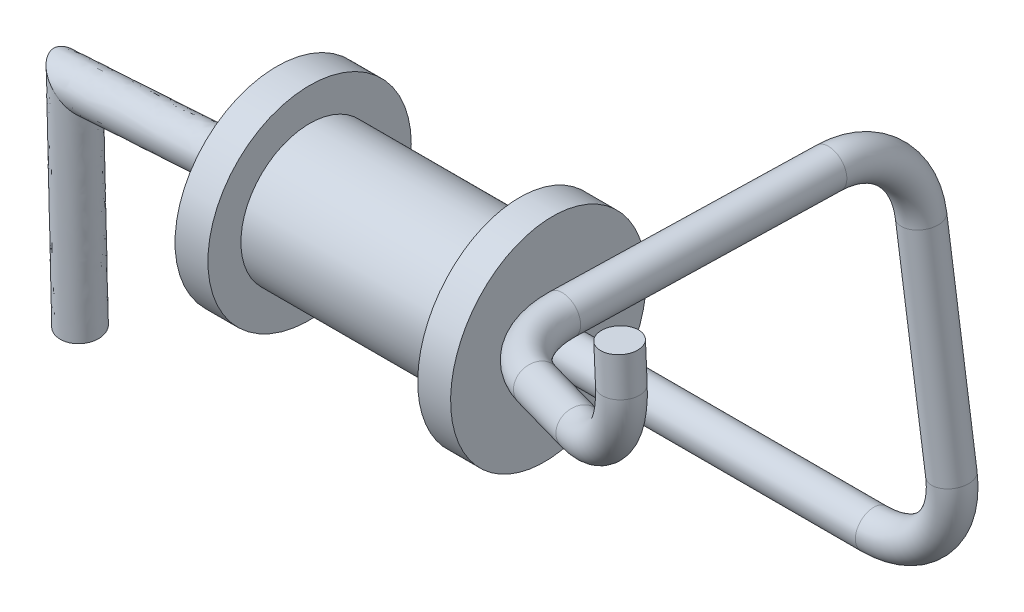
ISO-10303-21;
HEADER;
FILE_DESCRIPTION(('STEP AP214'),'2;1');
FILE_NAME('part.step','',(''),(''),'','','');
FILE_SCHEMA(('AUTOMOTIVE_DESIGN { 1 0 10303 214 1 1 1 1 }'));
ENDSEC;
DATA;
#1=APPLICATION_CONTEXT('core data for automotive mechanical design processes');
#2=APPLICATION_PROTOCOL_DEFINITION('international standard','automotive_design',2000,#1);
#3=PRODUCT_CONTEXT('',#1,'mechanical');
#4=PRODUCT('Part','Part','',(#3));
#5=PRODUCT_RELATED_PRODUCT_CATEGORY('part','',(#4));
#6=PRODUCT_DEFINITION_FORMATION('','',#4);
#7=PRODUCT_DEFINITION_CONTEXT('part definition',#1,'design');
#8=PRODUCT_DEFINITION('design','',#6,#7);
#9=PRODUCT_DEFINITION_SHAPE('','',#8);
#10=(LENGTH_UNIT() NAMED_UNIT(*) SI_UNIT(.MILLI.,.METRE.));
#11=(NAMED_UNIT(*) PLANE_ANGLE_UNIT() SI_UNIT($,.RADIAN.));
#12=(NAMED_UNIT(*) SI_UNIT($,.STERADIAN.) SOLID_ANGLE_UNIT());
#13=UNCERTAINTY_MEASURE_WITH_UNIT(LENGTH_MEASURE(1.E-05),#10,'distance_accuracy_value','');
#14=(GEOMETRIC_REPRESENTATION_CONTEXT(3) GLOBAL_UNCERTAINTY_ASSIGNED_CONTEXT((#13)) GLOBAL_UNIT_ASSIGNED_CONTEXT((#10,
#11,#12)) REPRESENTATION_CONTEXT('',''));
#15=CARTESIAN_POINT('',(0.,0.,0.));
#16=DIRECTION('',(0.,0.,1.));
#17=DIRECTION('',(1.,0.,0.));
#18=AXIS2_PLACEMENT_3D('',#15,#16,#17);
#19=CARTESIAN_POINT('',(4.,0.,0.));
#20=DIRECTION('',(-1.,0.,0.));
#21=DIRECTION('',(0.,0.,1.));
#22=AXIS2_PLACEMENT_3D('',#19,#20,#21);
#23=CYLINDRICAL_SURFACE('',#22,12.3707155239652);
#24=CARTESIAN_POINT('',(4.,0.,0.));
#25=DIRECTION('',(1.,0.,0.));
#26=DIRECTION('',(0.,0.,-1.));
#27=AXIS2_PLACEMENT_3D('',#24,#25,#26);
#28=CIRCLE('',#27,12.3707155239652);
#29=CARTESIAN_POINT('',(4.,0.,-12.3707155239652));
#30=VERTEX_POINT('',#29);
#31=EDGE_CURVE('E148',#30,#30,#28,.T.);
#32=ORIENTED_EDGE('',*,*,#31,.F.);
#33=EDGE_LOOP('',(#32));
#34=FACE_BOUND('',#33,.T.);
#35=CARTESIAN_POINT('',(0.,0.,0.));
#36=DIRECTION('',(1.,0.,0.));
#37=DIRECTION('',(0.,0.,-1.));
#38=AXIS2_PLACEMENT_3D('',#35,#36,#37);
#39=CIRCLE('',#38,12.3707155239652);
#40=CARTESIAN_POINT('',(0.,0.,-12.3707155239652));
#41=VERTEX_POINT('',#40);
#42=EDGE_CURVE('E36',#41,#41,#39,.T.);
#43=ORIENTED_EDGE('',*,*,#42,.T.);
#44=EDGE_LOOP('',(#43));
#45=FACE_BOUND('',#44,.T.);
#46=ADVANCED_FACE('F33',(#34,#45),#23,.T.);
#47=CARTESIAN_POINT('',(4.,0.,0.));
#48=DIRECTION('',(1.,0.,0.));
#49=DIRECTION('',(0.,0.,-1.));
#50=AXIS2_PLACEMENT_3D('',#47,#48,#49);
#51=PLANE('',#50);
#52=CARTESIAN_POINT('',(4.,0.,0.));
#53=DIRECTION('',(1.,0.,0.));
#54=DIRECTION('',(0.,0.,-1.));
#55=AXIS2_PLACEMENT_3D('',#52,#53,#54);
#56=CIRCLE('',#55,8.35595579056687);
#57=CARTESIAN_POINT('',(4.,0.,-8.35595579056687));
#58=VERTEX_POINT('',#57);
#59=EDGE_CURVE('E45',#58,#58,#56,.T.);
#60=ORIENTED_EDGE('',*,*,#59,.F.);
#61=EDGE_LOOP('',(#60));
#62=FACE_BOUND('',#61,.T.);
#63=ORIENTED_EDGE('',*,*,#31,.T.);
#64=EDGE_LOOP('',(#63));
#65=FACE_BOUND('',#64,.T.);
#66=ADVANCED_FACE('F137',(#62,#65),#51,.T.);
#67=CARTESIAN_POINT('',(0.,0.,0.));
#68=DIRECTION('',(1.,0.,0.));
#69=DIRECTION('',(0.,0.,-1.));
#70=AXIS2_PLACEMENT_3D('',#67,#68,#69);
#71=PLANE('',#70);
#72=CARTESIAN_POINT('',(0.,0.,0.));
#73=DIRECTION('',(-1.,0.,0.));
#74=DIRECTION('',(0.,0.,1.));
#75=AXIS2_PLACEMENT_3D('',#72,#73,#74);
#76=CIRCLE('',#75,2.44207125569347);
#77=CARTESIAN_POINT('',(0.,0.,2.44207125569347));
#78=VERTEX_POINT('',#77);
#79=EDGE_CURVE('E40',#78,#78,#76,.T.);
#80=ORIENTED_EDGE('',*,*,#79,.F.);
#81=EDGE_LOOP('',(#80));
#82=FACE_BOUND('',#81,.T.);
#83=ORIENTED_EDGE('',*,*,#42,.F.);
#84=EDGE_LOOP('',(#83));
#85=FACE_BOUND('',#84,.T.);
#86=ADVANCED_FACE('F142',(#82,#85),#71,.F.);
#87=CARTESIAN_POINT('',(29.,0.,0.));
#88=DIRECTION('',(-1.,0.,0.));
#89=DIRECTION('',(0.,0.,1.));
#90=AXIS2_PLACEMENT_3D('',#87,#88,#89);
#91=CYLINDRICAL_SURFACE('',#90,8.35595579056687);
#92=CARTESIAN_POINT('',(29.,0.,0.));
#93=DIRECTION('',(1.,0.,0.));
#94=DIRECTION('',(0.,0.,-1.));
#95=AXIS2_PLACEMENT_3D('',#92,#93,#94);
#96=CIRCLE('',#95,8.35595579056687);
#97=CARTESIAN_POINT('',(29.,0.,-8.35595579056687));
#98=VERTEX_POINT('',#97);
#99=EDGE_CURVE('E152',#98,#98,#96,.T.);
#100=ORIENTED_EDGE('',*,*,#99,.F.);
#101=EDGE_LOOP('',(#100));
#102=FACE_BOUND('',#101,.T.);
#103=ORIENTED_EDGE('',*,*,#59,.T.);
#104=EDGE_LOOP('',(#103));
#105=FACE_BOUND('',#104,.T.);
#106=ADVANCED_FACE('F164',(#102,#105),#91,.T.);
#107=CARTESIAN_POINT('',(33.,0.100289249061352,-0.065763954930336));
#108=DIRECTION('',(1.,0.,0.));
#109=DIRECTION('',(0.,-0.959592970850484,0.281391773679228));
#110=AXIS2_PLACEMENT_3D('',#107,#108,#109);
#111=ELLIPSE('',#110,12.7666889089816,11.8329045708875);
#112=DIRECTION('',(-1.,0.,0.));
#113=VECTOR('',#112,1.);
#114=SURFACE_OF_LINEAR_EXTRUSION('',#111,#113);
#115=CARTESIAN_POINT('',(33.,-12.1505356890322,3.52667728117892));
#116=VERTEX_POINT('',#115);
#117=EDGE_CURVE('E154',#116,#116,#111,.T.);
#118=ORIENTED_EDGE('',*,*,#117,.F.);
#119=EDGE_LOOP('',(#118));
#120=FACE_BOUND('',#119,.T.);
#121=CARTESIAN_POINT('',(29.,0.100289249061352,-0.065763954930336));
#122=DIRECTION('',(1.,0.,0.));
#123=DIRECTION('',(0.,-0.959592970850484,0.281391773679228));
#124=AXIS2_PLACEMENT_3D('',#121,#122,#123);
#125=ELLIPSE('',#124,12.7666889089816,11.8329045708875);
#126=CARTESIAN_POINT('',(29.,-12.1505356890322,3.52667728117892));
#127=VERTEX_POINT('',#126);
#128=EDGE_CURVE('E84',#127,#127,#125,.T.);
#129=ORIENTED_EDGE('',*,*,#128,.T.);
#130=EDGE_LOOP('',(#129));
#131=FACE_BOUND('',#130,.T.);
#132=ADVANCED_FACE('F167',(#120,#131),#114,.F.);
#133=CARTESIAN_POINT('',(33.,0.100289249061352,-0.065763954930336));
#134=DIRECTION('',(1.,0.,0.));
#135=DIRECTION('',(0.,0.,-1.));
#136=AXIS2_PLACEMENT_3D('',#133,#134,#135);
#137=PLANE('',#136);
#138=CARTESIAN_POINT('',(33.,0.,0.));
#139=DIRECTION('',(1.,0.,0.));
#140=DIRECTION('',(0.,0.,-1.));
#141=AXIS2_PLACEMENT_3D('',#138,#139,#140);
#142=CIRCLE('',#141,2.22597131513763);
#143=CARTESIAN_POINT('',(33.,0.,-2.22597131513763));
#144=VERTEX_POINT('',#143);
#145=EDGE_CURVE('E10',#144,#144,#142,.T.);
#146=ORIENTED_EDGE('',*,*,#145,.F.);
#147=EDGE_LOOP('',(#146));
#148=FACE_BOUND('',#147,.T.);
#149=ORIENTED_EDGE('',*,*,#117,.T.);
#150=EDGE_LOOP('',(#149));
#151=FACE_BOUND('',#150,.T.);
#152=ADVANCED_FACE('F174',(#148,#151),#137,.T.);
#153=CARTESIAN_POINT('',(29.,0.100289249061352,-0.065763954930336));
#154=DIRECTION('',(1.,0.,0.));
#155=DIRECTION('',(0.,0.,-1.));
#156=AXIS2_PLACEMENT_3D('',#153,#154,#155);
#157=PLANE('',#156);
#158=ORIENTED_EDGE('',*,*,#99,.T.);
#159=EDGE_LOOP('',(#158));
#160=FACE_BOUND('',#159,.T.);
#161=ORIENTED_EDGE('',*,*,#128,.F.);
#162=EDGE_LOOP('',(#161));
#163=FACE_BOUND('',#162,.T.);
#164=ADVANCED_FACE('F179',(#160,#163),#157,.F.);
#165=CARTESIAN_POINT('',(-23.3305297371578,-26.3298090305077,0.595999902795145));
#166=DIRECTION('',(-0.0155432074786544,-0.9965610600113,-0.0813908002813002));
#167=DIRECTION('',(0.0281251309692267,-0.0818041813511398,0.996251500837732));
#168=AXIS2_PLACEMENT_3D('',#165,#166,#167);
#169=PLANE('',#168);
#170=CARTESIAN_POINT('',(-23.3305297371578,-26.3298090305077,0.595999902795145));
#171=DIRECTION('',(-0.0155432074786544,-0.9965610600113,-0.0813908002813002));
#172=DIRECTION('',(0.0281251309692267,-0.0818041813511398,0.996251500837732));
#173=AXIS2_PLACEMENT_3D('',#170,#171,#172);
#174=CIRCLE('',#173,2.44207125569347);
#175=CARTESIAN_POINT('',(-23.2618461632552,-26.5295806703809,3.02891705643245));
#176=VERTEX_POINT('',#175);
#177=EDGE_CURVE('E74',#176,#176,#174,.T.);
#178=ORIENTED_EDGE('',*,*,#177,.T.);
#179=EDGE_LOOP('',(#178));
#180=FACE_BOUND('',#179,.T.);
#181=ADVANCED_FACE('F103',(#180),#169,.T.);
#182=CARTESIAN_POINT('',(-23.2028706245278,5.07524915346956,3.86902853192067));
#183=CARTESIAN_POINT('',(-23.2618461632552,-26.5295806703809,3.02891705643245));
#184=CARTESIAN_POINT('',(-28.0844907669103,5.13969940357206,4.01213346644188));
#185=CARTESIAN_POINT('',(-28.1434663056377,-26.4651304202784,3.17202199095365));
#186=CARTESIAN_POINT('',(-28.2218579147155,5.53924268331837,-0.853700840832734));
#187=CARTESIAN_POINT('',(-28.2808334534428,-26.0655871405321,-1.69381231632096));
#188=CARTESIAN_POINT('',(-23.340237772333,5.47479243321586,-0.996805775353938));
#189=CARTESIAN_POINT('',(-23.3992133110603,-26.1300373906346,-1.83691725084216));
#190=CARTESIAN_POINT('',(-18.4586176299505,5.41034218311336,-1.13991070987514));
#191=CARTESIAN_POINT('',(-18.5175931686778,-26.1944876407371,-1.98002218536337));
#192=CARTESIAN_POINT('',(-18.3212504821453,5.01079890336705,3.72592359739947));
#193=CARTESIAN_POINT('',(-18.3802260208727,-26.5940309204834,2.88581212191125));
#194=CARTESIAN_POINT('',(-23.2028706245278,5.07524915346956,3.86902853192067));
#195=CARTESIAN_POINT('',(-23.2618461632552,-26.5295806703809,3.02891705643245));
#196=(BOUNDED_SURFACE() B_SPLINE_SURFACE(3,1,((#182,#183),(#184,#185),(#186,#187),(#188,#189),
(#190,#191),(#192,#193),(#194,#195)),.UNSPECIFIED.,.T.,.F.,.F.) B_SPLINE_SURFACE_WITH_KNOTS((4,
3,4),(2,2),(0.,0.5,1.),(0.,1.),
.UNSPECIFIED.) GEOMETRIC_REPRESENTATION_ITEM() RATIONAL_B_SPLINE_SURFACE(((1.,1.),
(0.333333333333333,0.333333333333333),(0.333333333333333,0.333333333333333),(1.,1.),
(0.333333333333333,0.333333333333333),(0.333333333333333,0.333333333333333),(1.,1.))) REPRESENTATION_ITEM('') SURFACE());
#197=CARTESIAN_POINT('',(-23.2128663806339,-0.281449191471586,3.72663815122899));
#198=CARTESIAN_POINT('',(-23.0684587121008,-0.424443925889251,3.71864875398941));
#199=CARTESIAN_POINT('',(-22.924534512076,-0.567324026092381,3.69784049343618));
#200=CARTESIAN_POINT('',(-22.63883423045,-0.851697510933992,3.63022198284289));
#201=CARTESIAN_POINT('',(-22.4970893935195,-0.99316662981185,3.58317803038561));
#202=CARTESIAN_POINT('',(-22.21963915056,-1.27090377430165,3.46193241064531));
#203=CARTESIAN_POINT('',(-22.0839413806909,-1.40716519443489,3.38769743927248));
#204=CARTESIAN_POINT('',(-21.8403446025068,-1.65267887183553,3.22250429081013));
#205=CARTESIAN_POINT('',(-21.7311692724878,-1.7630902202218,3.13517082803063));
#206=CARTESIAN_POINT('',(-21.523940202056,-1.97356334684906,2.93772139186325));
#207=CARTESIAN_POINT('',(-21.4258694183012,-2.07364096399891,2.82764108480416));
#208=CARTESIAN_POINT('',(-21.2685792169189,-2.23518677640959,2.61450531712893));
#209=CARTESIAN_POINT('',(-21.2057945458416,-2.30003212148381,2.51665821976654));
#210=CARTESIAN_POINT('',(-21.0922219384939,-2.41823345476983,2.30786859765149));
#211=CARTESIAN_POINT('',(-21.0414178206382,-2.47160493149555,2.19694404349324));
#212=CARTESIAN_POINT('',(-20.9634606357256,-2.55466788572738,1.98558890031515));
#213=CARTESIAN_POINT('',(-20.9336491489583,-2.58693087295371,1.88715975817442));
#214=CARTESIAN_POINT('',(-20.8861212931429,-2.6396674671327,1.68435934220253));
#215=CARTESIAN_POINT('',(-20.8683968707516,-2.66014892243247,1.57999207514129));
#216=CARTESIAN_POINT('',(-20.8465277658761,-2.68779422185828,1.36744854524152));
#217=CARTESIAN_POINT('',(-20.842459836027,-2.69488269733116,1.25925419620652));
#218=CARTESIAN_POINT('',(-20.8487837569033,-2.69475175716478,1.04329822373755));
#219=CARTESIAN_POINT('',(-20.8591722891677,-2.68753562496725,0.935536506687566));
#220=CARTESIAN_POINT('',(-20.8922203732133,-2.66058027775096,0.733820644079748));
#221=CARTESIAN_POINT('',(-20.9136791619833,-2.64203853707522,0.639501596230035));
#222=CARTESIAN_POINT('',(-20.9668415698841,-2.59466546999811,0.456545708227726));
#223=CARTESIAN_POINT('',(-20.9985469759998,-2.56583234871349,0.367909862445247));
#224=CARTESIAN_POINT('',(-21.0729482339714,-2.49724989396901,0.192421072495969));
#225=CARTESIAN_POINT('',(-21.1162144902333,-2.45692327333233,0.106039410006878));
#226=CARTESIAN_POINT('',(-21.2106714959056,-2.36818002321727,-0.0577106099738942));
#227=CARTESIAN_POINT('',(-21.2618668505383,-2.31975869102284,-0.135073683408106));
#228=CARTESIAN_POINT('',(-21.4009897462154,-2.18749635886743,-0.321393696363401));
#229=CARTESIAN_POINT('',(-21.4934123605298,-2.09902361501496,-0.423728530244451));
#230=CARTESIAN_POINT('',(-21.6884362884356,-1.91139969954375,-0.606690991734129));
#231=CARTESIAN_POINT('',(-21.7910635649717,-1.81222123237972,-0.687261206475955));
#232=CARTESIAN_POINT('',(-22.0423748297233,-1.5684973601089,-0.854290379223574));
#233=CARTESIAN_POINT('',(-22.1939764413289,-1.42081283200187,-0.931766255117624));
#234=CARTESIAN_POINT('',(-22.5033775853207,-1.11832874512138,-1.05187992626143));
#235=CARTESIAN_POINT('',(-22.6611804878002,-0.963525309574913,-1.09449849603694));
#236=CARTESIAN_POINT('',(-22.9828106234001,-0.647062634163571,-1.1479883325709));
#237=CARTESIAN_POINT('',(-23.1466915422022,-0.485328023176628,-1.15807303334321));
#238=CARTESIAN_POINT('',(-23.4735705496054,-0.161803096026666,-1.14548442691826));
#239=CARTESIAN_POINT('',(-23.6365674466851,-1.29196625368519E-05,-1.12277449209639));
#240=CARTESIAN_POINT('',(-23.8914095150296,0.253695801463184,-1.0606903249533));
#241=CARTESIAN_POINT('',(-23.9847888641693,0.346825455604939,-1.03209950756872));
#242=CARTESIAN_POINT('',(-24.1692803132398,0.531170755031897,-0.963363600502911));
#243=CARTESIAN_POINT('',(-24.2603916548123,0.622385758554771,-0.923214701039456));
#244=CARTESIAN_POINT('',(-24.4392193251888,0.801794459002192,-0.831092283443859));
#245=CARTESIAN_POINT('',(-24.5269415403331,0.889993360653054,-0.779140455116842));
#246=CARTESIAN_POINT('',(-24.6979633072726,1.06236756583207,-0.662929102592391));
#247=CARTESIAN_POINT('',(-24.7812662687555,1.14654596623877,-0.59867924868648));
#248=CARTESIAN_POINT('',(-24.9551752388245,1.32281529807729,-0.445751904262429));
#249=CARTESIAN_POINT('',(-25.0447657286359,1.4139666766093,-0.354801065267833));
#250=CARTESIAN_POINT('',(-25.2128955166439,1.58585956532774,-0.15469965227404));
#251=CARTESIAN_POINT('',(-25.2914525005864,1.6666177171426,-0.0455788313650212));
#252=CARTESIAN_POINT('',(-25.4182907978081,1.79801233728255,0.165969549504738));
#253=CARTESIAN_POINT('',(-25.4694614697152,1.8514071639757,0.264932649734763));
#254=CARTESIAN_POINT('',(-25.5596038594051,1.94643945429959,0.473552319138405));
#255=CARTESIAN_POINT('',(-25.5985899210037,1.98809073682076,0.583196113856821));
#256=CARTESIAN_POINT('',(-25.6562890005796,2.05106347232968,0.792360580841113));
#257=CARTESIAN_POINT('',(-25.6772813983696,2.07460158686155,0.890581479777734));
#258=CARTESIAN_POINT('',(-25.7071937073611,2.10985468447219,1.09098530146758));
#259=CARTESIAN_POINT('',(-25.7161211931254,2.12157708448704,1.19316569688532));
#260=CARTESIAN_POINT('',(-25.719807654174,2.12958869769749,1.34723387541147));
#261=CARTESIAN_POINT('',(-25.7194077589957,2.13065591125226,1.39883341418816));
#262=CARTESIAN_POINT('',(-25.7153375438002,2.1295526181451,1.50187645042235));
#263=CARTESIAN_POINT('',(-25.7116675879481,2.12738247198846,1.5533199646152));
#264=CARTESIAN_POINT('',(-25.7010896904947,2.1198245767064,1.6556292286261));
#265=CARTESIAN_POINT('',(-25.694181949871,2.11443702728781,1.70649501410456));
#266=CARTESIAN_POINT('',(-25.6772334131906,2.10053747540749,1.80727523408451));
#267=CARTESIAN_POINT('',(-25.6671914932973,2.09202435200145,1.85718932050802));
#268=CARTESIAN_POINT('',(-25.6337154430965,2.06297918407042,2.00010342422111));
#269=CARTESIAN_POINT('',(-25.606363501643,2.03852660367626,2.09143816065783));
#270=CARTESIAN_POINT('',(-25.5422392436122,1.98012197155552,2.26754408719776));
#271=CARTESIAN_POINT('',(-25.50545608745,1.94615898506085,2.35230757779115));
#272=CARTESIAN_POINT('',(-25.4367239304189,1.88208273008365,2.48903970380018));
#273=CARTESIAN_POINT('',(-25.4068062387844,1.85403513903713,2.54303442704334));
#274=CARTESIAN_POINT('',(-25.34379656596,1.7946920704096,2.64715600779253));
#275=CARTESIAN_POINT('',(-25.3107075231671,1.76339959719406,2.69728636954773));
#276=CARTESIAN_POINT('',(-25.2072169143514,1.66518626367176,2.84201921648317));
#277=CARTESIAN_POINT('',(-25.1326705573184,1.59400297774131,2.93081148200242));
#278=CARTESIAN_POINT('',(-24.9469342096803,1.41581897550897,3.12286810150022));
#279=CARTESIAN_POINT('',(-24.8323433519552,1.30526702508718,3.21946538945701));
#280=CARTESIAN_POINT('',(-24.5939959707554,1.07435287329118,3.38624794139292));
#281=CARTESIAN_POINT('',(-24.4702196331513,0.95396940452282,3.45637399817355));
#282=CARTESIAN_POINT('',(-24.2526091778536,0.741653161543106,3.55599737456876));
#283=CARTESIAN_POINT('',(-24.1600172586588,0.651115013319645,3.59136986958842));
#284=CARTESIAN_POINT('',(-23.9730300319736,0.467912605354942,3.65000687184844));
#285=CARTESIAN_POINT('',(-23.878633868135,0.375247331601284,3.67326547369868));
#286=CARTESIAN_POINT('',(-23.6890480294883,0.188801376849432,3.70810833805332));
#287=CARTESIAN_POINT('',(-23.5938594586375,0.0950221885101755,3.71970675612891));
#288=CARTESIAN_POINT('',(-23.4033327483039,-0.0930044145664909,3.73160141801773));
#289=CARTESIAN_POINT('',(-23.3079946641031,-0.187251675727057,3.7319011518236));
#290=CARTESIAN_POINT('',(-23.2128663806339,-0.281449191471586,3.72663815122899));
#291=B_SPLINE_CURVE_WITH_KNOTS('',3,(#197,#198,#199,#200,#201,#202,#203,#204,#205,#206,#207,
#208,#209,#210,#211,#212,#213,#214,#215,#216,#217,#218,#219,#220,#221,#222,#223,#224,#225,#226,
#227,#228,#229,#230,#231,#232,#233,#234,#235,#236,#237,#238,#239,#240,#241,#242,#243,#244,#245,
#246,#247,#248,#249,#250,#251,#252,#253,#254,#255,#256,#257,#258,#259,#260,#261,#262,#263,#264,
#265,#266,#267,#268,#269,#270,#271,#272,#273,#274,#275,#276,#277,#278,#279,#280,#281,#282,#283,
#284,#285,#286,#287,#288,#289,#290),.UNSPECIFIED.,.T.,.F.,(4,2,2,2,2,2,2,2,2,2,2,2,2,2,2,2,2,2,
2,2,2,2,2,2,2,2,2,2,2,2,2,2,2,2,2,2,2,2,2,2,2,2,2,2,2,2,4),(0.,0.609878966037011,
1.22527944683679,1.84143621649082,2.37417488597034,2.90608449169785,3.30408374675637,
3.70154232348091,4.02359783649103,4.34543856084903,4.66908510292824,4.99265736464026,
5.28682858828857,5.58105114238771,5.8939718404048,6.20707496914526,6.69582033612733,
7.18584264573011,7.85837127241032,8.53127058118206,9.22032111448952,9.91014182902196,
10.314532308881,10.7190562371044,11.122842714919,11.5263129785585,11.9953990717825,
12.4637244636286,12.8330125100851,13.2018641759741,13.5100676330414,13.8180775045581,
13.9727414405039,14.127388154698,14.2820252708424,14.4367178997303,14.7306742727636,
15.0249700252952,15.2281154288139,15.4310743960022,15.8375438916717,16.3933397621192,
16.9503714962603,17.3525454688702,17.7549153138111,18.1567960860007,18.5585527222817),.UNSPECIFIED.);
#292=CARTESIAN_POINT('',(-23.2128663806339,-0.281449191471586,3.72663815122899));
#293=VERTEX_POINT('',#292);
#294=EDGE_CURVE('E76',#293,#293,#291,.T.);
#295=ORIENTED_EDGE('',*,*,#294,.F.);
#296=EDGE_LOOP('',(#295));
#297=FACE_BOUND('',#296,.T.);
#298=ORIENTED_EDGE('',*,*,#177,.F.);
#299=EDGE_LOOP('',(#298));
#300=FACE_BOUND('',#299,.T.);
#301=ADVANCED_FACE('F187',(#297,#300),#196,.T.);
#302=CARTESIAN_POINT('',(0.,0.,2.44207125569347));
#303=CARTESIAN_POINT('',(-28.8177382927566,-0.349406618275403,4.03680376343604));
#304=CARTESIAN_POINT('',(0.,4.88414251138694,2.44207125569347));
#305=CARTESIAN_POINT('',(-28.8177382927566,4.53473589311154,4.03680376343604));
#306=CARTESIAN_POINT('',(0.,4.88414251138694,-2.44207125569347));
#307=CARTESIAN_POINT('',(-28.8177382927566,4.53473589311154,-0.847338747950905));
#308=CARTESIAN_POINT('',(0.,0.,-2.44207125569347));
#309=CARTESIAN_POINT('',(-28.8177382927566,-0.349406618275403,-0.847338747950905));
#310=CARTESIAN_POINT('',(0.,-4.88414251138694,-2.44207125569347));
#311=CARTESIAN_POINT('',(-28.8177382927566,-5.23354912966235,-0.847338747950906));
#312=CARTESIAN_POINT('',(0.,-4.88414251138694,2.44207125569347));
#313=CARTESIAN_POINT('',(-28.8177382927566,-5.23354912966235,4.03680376343604));
#314=CARTESIAN_POINT('',(0.,0.,2.44207125569347));
#315=CARTESIAN_POINT('',(-28.8177382927566,-0.349406618275403,4.03680376343604));
#316=(BOUNDED_SURFACE() B_SPLINE_SURFACE(3,1,((#302,#303),(#304,#305),(#306,#307),(#308,#309),
(#310,#311),(#312,#313),(#314,#315)),.UNSPECIFIED.,.T.,.F.,.F.) B_SPLINE_SURFACE_WITH_KNOTS((4,
3,4),(2,2),(0.,0.5,1.),(0.,1.),
.UNSPECIFIED.) GEOMETRIC_REPRESENTATION_ITEM() RATIONAL_B_SPLINE_SURFACE(((1.,1.),
(0.333333333333333,0.333333333333333),(0.333333333333333,0.333333333333333),(1.,1.),
(0.333333333333333,0.333333333333333),(0.333333333333333,0.333333333333333),(1.,1.))) REPRESENTATION_ITEM('') SURFACE());
#317=CARTESIAN_POINT('',(0.,0.,2.44207125569347));
#318=CARTESIAN_POINT('',(-0.241800691464937,-0.00293176241116236,2.4554521608553));
#319=CARTESIAN_POINT('',(-0.483601382929873,-0.00586352482232471,2.46883306601713));
#320=CARTESIAN_POINT('',(-0.967202765859746,-0.0117270496446494,2.49559487634078));
#321=CARTESIAN_POINT('',(-1.20900345732468,-0.0146588120558118,2.50897578150261));
#322=CARTESIAN_POINT('',(-1.69260484025456,-0.0205223368781365,2.53573759182627));
#323=CARTESIAN_POINT('',(-1.93440553171949,-0.0234540992892988,2.5491184969881));
#324=CARTESIAN_POINT('',(-2.41800691464936,-0.0293176241116235,2.57588030731175));
#325=CARTESIAN_POINT('',(-2.6598076061143,-0.0322493865227859,2.58926121247358));
#326=CARTESIAN_POINT('',(-3.14340898904417,-0.0381129113451106,2.61602302279724));
#327=CARTESIAN_POINT('',(-3.38520968050911,-0.0410446737562729,2.62940392795907));
#328=CARTESIAN_POINT('',(-3.86881106343898,-0.0469081985785976,2.65616573828272));
#329=CARTESIAN_POINT('',(-4.11061175490392,-0.04983996098976,2.66954664344455));
#330=CARTESIAN_POINT('',(-4.59421313783379,-0.0557034858120847,2.69630845376821));
#331=CARTESIAN_POINT('',(-4.83601382929873,-0.0586352482232471,2.70968935893004));
#332=CARTESIAN_POINT('',(-5.3196152122286,-0.0644987730455718,2.7364511692537));
#333=CARTESIAN_POINT('',(-5.56141590369354,-0.0674305354567341,2.74983207441552));
#334=CARTESIAN_POINT('',(-6.04501728662341,-0.0732940602790588,2.77659388473918));
#335=CARTESIAN_POINT('',(-6.28681797808835,-0.0762258226902212,2.78997478990101));
#336=CARTESIAN_POINT('',(-6.77041936101822,-0.0820893475125459,2.81673660022467));
#337=CARTESIAN_POINT('',(-7.01222005248316,-0.0850211099237082,2.83011750538649));
#338=CARTESIAN_POINT('',(-7.49582143541303,-0.0908846347460329,2.85687931571015));
#339=CARTESIAN_POINT('',(-7.73762212687797,-0.0938163971571953,2.87026022087198));
#340=CARTESIAN_POINT('',(-8.22122350980784,-0.09967992197952,2.89702203119564));
#341=CARTESIAN_POINT('',(-8.46302420127278,-0.102611684390682,2.91040293635746));
#342=CARTESIAN_POINT('',(-8.94662558420265,-0.108475209213007,2.93716474668112));
#343=CARTESIAN_POINT('',(-9.18842627566759,-0.111406971624169,2.95054565184295));
#344=CARTESIAN_POINT('',(-9.67202765859746,-0.117270496446494,2.97730746216661));
#345=CARTESIAN_POINT('',(-9.9138283500624,-0.120202258857656,2.99068836732843));
#346=CARTESIAN_POINT('',(-10.3974297329923,-0.126065783679981,3.01745017765209));
#347=CARTESIAN_POINT('',(-10.6392304244572,-0.128997546091144,3.03083108281392));
#348=CARTESIAN_POINT('',(-11.1228318073871,-0.134861070913468,3.05759289313758));
#349=CARTESIAN_POINT('',(-11.364632498852,-0.137792833324631,3.0709737982994));
#350=CARTESIAN_POINT('',(-11.8482338817819,-0.143656358146955,3.09773560862306));
#351=CARTESIAN_POINT('',(-12.0900345732468,-0.146588120558118,3.11111651378489));
#352=CARTESIAN_POINT('',(-12.5736359561767,-0.152451645380442,3.13787832410855));
#353=CARTESIAN_POINT('',(-12.8154366476416,-0.155383407791605,3.15125922927037));
#354=CARTESIAN_POINT('',(-13.2990380305715,-0.161246932613929,3.17802103959403));
#355=CARTESIAN_POINT('',(-13.5408387220364,-0.164178695025092,3.19140194475586));
#356=CARTESIAN_POINT('',(-14.0244401049663,-0.170042219847416,3.21816375507952));
#357=CARTESIAN_POINT('',(-14.2662407964312,-0.172973982258579,3.23154466024134));
#358=CARTESIAN_POINT('',(-14.7498421793611,-0.178837507080904,3.258306470565));
#359=CARTESIAN_POINT('',(-14.9916428708261,-0.181769269492066,3.27168737572683));
#360=CARTESIAN_POINT('',(-15.4752442537559,-0.187632794314391,3.29844918605049));
#361=CARTESIAN_POINT('',(-15.7170449452209,-0.190564556725553,3.31183009121231));
#362=CARTESIAN_POINT('',(-16.2006463281507,-0.196428081547878,3.33859190153597));
#363=CARTESIAN_POINT('',(-16.4424470196157,-0.19935984395904,3.3519728066978));
#364=CARTESIAN_POINT('',(-16.9260484025456,-0.205223368781365,3.37873461702146));
#365=CARTESIAN_POINT('',(-17.1678490940105,-0.208155131192527,3.39211552218328));
#366=CARTESIAN_POINT('',(-17.6514504769404,-0.214018656014852,3.41887733250694));
#367=CARTESIAN_POINT('',(-17.8932511684053,-0.216950418426014,3.43225823766877));
#368=CARTESIAN_POINT('',(-18.3768525513352,-0.222813943248339,3.45902004799243));
#369=CARTESIAN_POINT('',(-18.6186532428001,-0.225745705659501,3.47240095315425));
#370=CARTESIAN_POINT('',(-19.10225462573,-0.231609230481826,3.49916276347791));
#371=CARTESIAN_POINT('',(-19.3440553171949,-0.234540992892988,3.51254366863974));
#372=CARTESIAN_POINT('',(-19.8276567001248,-0.240404517715313,3.5393054789634));
#373=CARTESIAN_POINT('',(-20.0694573915897,-0.243336280126475,3.55268638412522));
#374=CARTESIAN_POINT('',(-20.5530587745196,-0.2491998049488,3.57944819444888));
#375=CARTESIAN_POINT('',(-20.7948594659845,-0.252131567359962,3.59282909961071));
#376=CARTESIAN_POINT('',(-21.2784608489144,-0.257995092182287,3.61959090993437));
#377=CARTESIAN_POINT('',(-21.5202615403793,-0.260926854593449,3.63297181509619));
#378=CARTESIAN_POINT('',(-22.0038629233092,-0.266790379415774,3.65973362541985));
#379=CARTESIAN_POINT('',(-22.2456636147742,-0.269722141826936,3.67311453058168));
#380=CARTESIAN_POINT('',(-22.729264997704,-0.275585666649261,3.69987634090534));
#381=CARTESIAN_POINT('',(-22.971065689169,-0.278517429060424,3.71325724606716));
#382=CARTESIAN_POINT('',(-23.2128663806339,-0.281449191471586,3.72663815122899));
#383=B_SPLINE_CURVE_WITH_KNOTS('',3,(#317,#318,#319,#320,#321,#322,#323,#324,#325,#326,#327,
#328,#329,#330,#331,#332,#333,#334,#335,#336,#337,#338,#339,#340,#341,#342,#343,#344,#345,#346,
#347,#348,#349,#350,#351,#352,#353,#354,#355,#356,#357,#358,#359,#360,#361,#362,#363,#364,#365,
#366,#367,#368,#369,#370,#371,#372,#373,#374,#375,#376,#377,#378,#379,#380,#381,#382),
.UNSPECIFIED.,.F.,.F.,(4,2,2,2,2,2,2,2,2,2,2,2,2,2,2,2,2,2,2,2,2,2,2,2,2,2,2,2,2,2,2,2,4),(0.,
0.726565182361748,1.4531303647235,2.17969554708525,2.90626072944699,3.63282591180874,
4.35939109417049,5.08595627653224,5.81252145889399,6.53908664125574,7.26565182361748,
7.99221700597924,8.71878218834098,9.44534737070273,10.1719125530645,10.8984777354262,
11.625042917788,12.3516081001497,13.0781732825115,13.8047384648732,14.531303647235,
15.2578688295967,15.9844340119585,16.7109991943202,17.437564376682,18.1641295590437,
18.8906947414055,19.6172599237672,20.343825106129,21.0703902884907,21.7969554708525,
22.5235206532142,23.250085835576),.UNSPECIFIED.);
#384=EDGE_CURVE('BSEAM86',#78,#293,#383,.T.);
#385=ORIENTED_EDGE('',*,*,#79,.T.);
#386=ORIENTED_EDGE('',*,*,#294,.T.);
#387=ORIENTED_EDGE('',*,*,#384,.T.);
#388=ORIENTED_EDGE('',*,*,#384,.F.);
#389=EDGE_LOOP('',(#385,#387,#386,#388));
#390=FACE_BOUND('',#389,.T.);
#391=ADVANCED_FACE('F86',(#390),#316,.T.);
#392=CARTESIAN_POINT('',(100.807738828486,63.4662288071507,59.0937211217739));
#393=DIRECTION('',(-0.0379832568359526,0.999250195640157,0.00750457948461381));
#394=DIRECTION('',(-0.932328731621733,-0.0327348235254328,-0.36012715465703));
#395=AXIS2_PLACEMENT_3D('',#392,#393,#394);
#396=PLANE('',#395);
#397=CARTESIAN_POINT('',(100.807738828486,63.4662288071507,59.0937211217739));
#398=DIRECTION('',(-0.0379832568359526,0.999250195640157,0.00750457948461381));
#399=DIRECTION('',(-0.932328731621733,-0.0327348235254328,-0.36012715465703));
#400=AXIS2_PLACEMENT_3D('',#397,#398,#399);
#401=CIRCLE('',#400,2.22597131513763);
#402=CARTESIAN_POINT('',(98.7324018156179,63.393362028977,58.2920884057052));
#403=VERTEX_POINT('',#402);
#404=EDGE_CURVE('E72',#403,#403,#401,.T.);
#405=ORIENTED_EDGE('',*,*,#404,.T.);
#406=EDGE_LOOP('',(#405));
#407=FACE_BOUND('',#406,.T.);
#408=ADVANCED_FACE('F93',(#407),#396,.T.);
#409=CARTESIAN_POINT('',(33.,0.,0.));
#410=DIRECTION('',(1.,0.,0.));
#411=DIRECTION('',(0.,1.,0.));
#412=AXIS2_PLACEMENT_3D('',#409,#410,#411);
#413=CYLINDRICAL_SURFACE('',#412,2.22597131513763);
#414=CARTESIAN_POINT('',(72.6228634302549,0.,0.));
#415=DIRECTION('',(1.,0.,0.));
#416=DIRECTION('',(0.,0.,-1.));
#417=AXIS2_PLACEMENT_3D('',#414,#415,#416);
#418=CIRCLE('',#417,2.22597131513763);
#419=CARTESIAN_POINT('',(72.6228634302549,-2.22361686675189,-0.102353923774623));
#420=VERTEX_POINT('',#419);
#421=EDGE_CURVE('E48',#420,#420,#418,.T.);
#422=ORIENTED_EDGE('',*,*,#421,.F.);
#423=EDGE_LOOP('',(#422));
#424=FACE_BOUND('',#423,.T.);
#425=ORIENTED_EDGE('',*,*,#145,.T.);
#426=EDGE_LOOP('',(#425));
#427=FACE_BOUND('',#426,.T.);
#428=ADVANCED_FACE('F96',(#424,#427),#413,.T.);
#429=CARTESIAN_POINT('',(72.6228634302549,9.98942282692364,0.459816903652544));
#430=DIRECTION('',(0.,-0.0459816903652663,0.998942282692625));
#431=DIRECTION('',(0.,-0.998942282692625,-0.0459816903652663));
#432=AXIS2_PLACEMENT_3D('',#429,#430,#431);
#433=TOROIDAL_SURFACE('',#432,9.99999999999739,2.22597131513763);
#434=CARTESIAN_POINT('',(82.5806788795909,10.9060096532163,0.502007741271176));
#435=DIRECTION('',(-0.0917557342574632,0.994728289559423,0.0457877186705955));
#436=DIRECTION('',(0.0457877186705955,0.0501476758994928,-0.99769168354799));
#437=AXIS2_PLACEMENT_3D('',#434,#435,#436);
#438=CIRCLE('',#437,2.22597131513763);
#439=CARTESIAN_POINT('',(84.7972600347572,11.1100392515324,0.511399300701249));
#440=VERTEX_POINT('',#439);
#441=EDGE_CURVE('E51',#440,#440,#438,.T.);
#442=CARTESIAN_POINT('',(72.6228634302549,9.98942282692364,0.459816903652544));
#443=DIRECTION('',(0.,-0.0459816903652663,0.998942282692625));
#444=DIRECTION('',(0.,-0.998942282692625,-0.0459816903652663));
#445=AXIS2_PLACEMENT_3D('',#442,#443,#444);
#446=CIRCLE('',#445,12.225971315135);
#447=EDGE_CURVE('',#420,#440,#446,.T.);
#448=ORIENTED_EDGE('',*,*,#421,.T.);
#449=ORIENTED_EDGE('',*,*,#441,.F.);
#450=ORIENTED_EDGE('',*,*,#447,.T.);
#451=ORIENTED_EDGE('',*,*,#447,.F.);
#452=EDGE_LOOP('',(#448,#450,#449,#451));
#453=FACE_BOUND('',#452,.T.);
#454=ADVANCED_FACE('F126',(#453),#433,.T.);
#455=CARTESIAN_POINT('',(82.5806788795909,10.9060096532163,0.502007741271176));
#456=DIRECTION('',(-0.0917557342574633,0.994728289559423,0.0457877186705955));
#457=DIRECTION('',(-0.995772663486014,-0.0918520694049397,0.));
#458=AXIS2_PLACEMENT_3D('',#455,#456,#457);
#459=CYLINDRICAL_SURFACE('',#458,2.22597131513763);
#460=CARTESIAN_POINT('',(80.1218445131281,37.5623502454942,1.72900916129451));
#461=DIRECTION('',(-0.0917557342574634,0.994728289559423,0.0457877186705955));
#462=DIRECTION('',(0.0457877186705955,0.0501476758994928,-0.99769168354799));
#463=AXIS2_PLACEMENT_3D('',#460,#461,#462);
#464=CIRCLE('',#463,2.22597131513763);
#465=CARTESIAN_POINT('',(80.1814205153574,37.6701509835544,-0.493551973218449));
#466=VERTEX_POINT('',#465);
#467=EDGE_CURVE('E54',#466,#466,#464,.T.);
#468=ORIENTED_EDGE('',*,*,#467,.F.);
#469=EDGE_LOOP('',(#468));
#470=FACE_BOUND('',#469,.T.);
#471=ORIENTED_EDGE('',*,*,#441,.T.);
#472=EDGE_LOOP('',(#471));
#473=FACE_BOUND('',#472,.T.);
#474=ADVANCED_FACE('F122',(#470,#473),#459,.T.);
#475=CARTESIAN_POINT('',(79.8542040371534,37.0780639596531,11.713689194617));
#476=DIRECTION('',(0.995421805561374,0.0903897000969684,0.0310665596633137));
#477=DIRECTION('',(-0.0904333506525598,0.995902509832037,0.));
#478=AXIS2_PLACEMENT_3D('',#475,#476,#477);
#479=TOROIDAL_SURFACE('',#478,9.99999999994316,2.22597131513763);
#480=CARTESIAN_POINT('',(78.948977698257,47.0369658180694,11.7426555313578));
#481=DIRECTION('',(-0.0306770560276411,-0.00569559912854681,0.999513120666279));
#482=DIRECTION('',(-0.0714775311475379,0.997436104527161,0.00348997517678432));
#483=AXIS2_PLACEMENT_3D('',#480,#481,#482);
#484=CIRCLE('',#483,2.22597131513763);
#485=CARTESIAN_POINT('',(78.7474769118468,49.2537888047925,11.7491033548268));
#486=VERTEX_POINT('',#485);
#487=EDGE_CURVE('E57',#486,#486,#484,.T.);
#488=CARTESIAN_POINT('',(79.8542040371534,37.0780639596531,11.713689194617));
#489=DIRECTION('',(0.995421805561374,0.0903897000969684,0.0310665596633137));
#490=DIRECTION('',(-0.0904333506525598,0.995902509832037,0.));
#491=AXIS2_PLACEMENT_3D('',#488,#489,#490);
#492=CIRCLE('',#491,12.2259713150808);
#493=EDGE_CURVE('',#466,#486,#492,.T.);
#494=ORIENTED_EDGE('',*,*,#467,.T.);
#495=ORIENTED_EDGE('',*,*,#487,.F.);
#496=ORIENTED_EDGE('',*,*,#493,.T.);
#497=ORIENTED_EDGE('',*,*,#493,.F.);
#498=EDGE_LOOP('',(#494,#496,#495,#497));
#499=FACE_BOUND('',#498,.T.);
#500=ADVANCED_FACE('F118',(#499),#479,.T.);
#501=CARTESIAN_POINT('',(78.948977698257,47.0369658180694,11.7426555313578));
#502=DIRECTION('',(-0.0306770560276395,-0.00569559912854691,0.999513120666279));
#503=DIRECTION('',(0.999529333088297,0.,0.0306775536192851));
#504=AXIS2_PLACEMENT_3D('',#501,#502,#503);
#505=CYLINDRICAL_SURFACE('',#504,2.22597131513763);
#506=CARTESIAN_POINT('',(77.9845456199613,46.8579063118464,43.1655702784395));
#507=DIRECTION('',(-0.0306770560276395,-0.00569559912854692,0.999513120666279));
#508=DIRECTION('',(-0.0714775311475379,0.997436104527161,0.00348997517678453));
#509=AXIS2_PLACEMENT_3D('',#506,#507,#508);
#510=CIRCLE('',#509,2.22597131513763);
#511=CARTESIAN_POINT('',(75.773971890056,46.6058905477477,43.0962872710431));
#512=VERTEX_POINT('',#511);
#513=EDGE_CURVE('E60',#512,#512,#510,.T.);
#514=ORIENTED_EDGE('',*,*,#513,.F.);
#515=EDGE_LOOP('',(#514));
#516=FACE_BOUND('',#515,.T.);
#517=ORIENTED_EDGE('',*,*,#487,.T.);
#518=EDGE_LOOP('',(#517));
#519=FACE_BOUND('',#518,.T.);
#520=ADVANCED_FACE('F114',(#516,#519),#505,.T.);
#521=CARTESIAN_POINT('',(87.915373186664,47.9900671909421,43.476818707048));
#522=DIRECTION('',(-0.113338239963966,0.993554063747427,0.00218306501143378));
#523=DIRECTION('',(-0.993556431282378,-0.113338510037084,0.));
#524=AXIS2_PLACEMENT_3D('',#521,#522,#523);
#525=TOROIDAL_SURFACE('',#524,10.0000000000024,2.22597131513763);
#526=CARTESIAN_POINT('',(84.5419569545418,47.5845845023193,52.8819049221833));
#527=DIRECTION('',(0.934534682401069,0.10585915313872,0.339762810040012));
#528=DIRECTION('',(-0.0990523211919182,0.994380325728224,-0.037368509083501));
#529=AXIS2_PLACEMENT_3D('',#526,#527,#528);
#530=CIRCLE('',#529,2.22597131513763);
#531=CARTESIAN_POINT('',(83.7910441778696,47.4943252189534,54.9754501353116));
#532=VERTEX_POINT('',#531);
#533=EDGE_CURVE('E63',#532,#532,#530,.T.);
#534=CARTESIAN_POINT('',(87.915373186664,47.9900671909421,43.476818707048));
#535=DIRECTION('',(-0.113338239963966,0.993554063747427,0.00218306501143378));
#536=DIRECTION('',(-0.993556431282378,-0.113338510037084,0.));
#537=AXIS2_PLACEMENT_3D('',#534,#535,#536);
#538=CIRCLE('',#537,12.22597131514);
#539=EDGE_CURVE('',#512,#532,#538,.T.);
#540=ORIENTED_EDGE('',*,*,#513,.T.);
#541=ORIENTED_EDGE('',*,*,#533,.F.);
#542=ORIENTED_EDGE('',*,*,#539,.T.);
#543=ORIENTED_EDGE('',*,*,#539,.F.);
#544=EDGE_LOOP('',(#540,#542,#541,#543));
#545=FACE_BOUND('',#544,.T.);
#546=ADVANCED_FACE('F110',(#545),#525,.T.);
#547=CARTESIAN_POINT('',(84.5419569545418,47.5845845023193,52.8819049221833));
#548=DIRECTION('',(0.934534682401069,0.105859153138719,0.339762810040014));
#549=DIRECTION('',(0.341682679221932,0.,-0.939815379061081));
#550=AXIS2_PLACEMENT_3D('',#547,#548,#549);
#551=CYLINDRICAL_SURFACE('',#550,2.22597131513763);
#552=CARTESIAN_POINT('',(92.6513317915896,48.5031716547284,55.8301785755743));
#553=DIRECTION('',(0.934534682401069,0.105859153138719,0.339762810040014));
#554=DIRECTION('',(-0.0990523211919176,0.994380325728224,-0.0373685090835007));
#555=AXIS2_PLACEMENT_3D('',#552,#553,#554);
#556=CIRCLE('',#555,2.22597131513763);
#557=CARTESIAN_POINT('',(92.8880204600031,46.2901542597191,55.868659472738));
#558=VERTEX_POINT('',#557);
#559=EDGE_CURVE('E66',#558,#558,#556,.T.);
#560=ORIENTED_EDGE('',*,*,#559,.F.);
#561=EDGE_LOOP('',(#560));
#562=FACE_BOUND('',#561,.T.);
#563=ORIENTED_EDGE('',*,*,#533,.T.);
#564=EDGE_LOOP('',(#563));
#565=FACE_BOUND('',#564,.T.);
#566=ADVANCED_FACE('F106',(#562,#565),#551,.T.);
#567=CARTESIAN_POINT('',(91.588026677075,58.4449771936063,55.6573061899231));
#568=DIRECTION('',(-0.339615591108733,-0.0199716293615787,0.940352266066557));
#569=DIRECTION('',(0.94053985945066,0.,0.339683341929706));
#570=AXIS2_PLACEMENT_3D('',#567,#568,#569);
#571=TOROIDAL_SURFACE('',#570,10.0000000000568,2.22597131513763);
#572=CARTESIAN_POINT('',(100.985997322305,58.776666888014,59.0585015237956));
#573=DIRECTION('',(-0.0379832568359524,0.999250195640158,0.00750457948461411));
#574=DIRECTION('',(-0.932328731621733,-0.0327348235254325,-0.36012715465703));
#575=AXIS2_PLACEMENT_3D('',#572,#573,#574);
#576=CIRCLE('',#575,2.22597131513763);
#577=CARTESIAN_POINT('',(103.077958629972,58.8505000625414,59.8155978488294));
#578=VERTEX_POINT('',#577);
#579=EDGE_CURVE('E69',#578,#578,#576,.T.);
#580=CARTESIAN_POINT('',(91.588026677075,58.4449771936063,55.6573061899231));
#581=DIRECTION('',(-0.339615591108733,-0.0199716293615787,0.940352266066557));
#582=DIRECTION('',(0.94053985945066,0.,0.339683341929706));
#583=AXIS2_PLACEMENT_3D('',#580,#581,#582);
#584=CIRCLE('',#583,12.2259713151945);
#585=EDGE_CURVE('',#558,#578,#584,.T.);
#586=ORIENTED_EDGE('',*,*,#559,.T.);
#587=ORIENTED_EDGE('',*,*,#579,.F.);
#588=ORIENTED_EDGE('',*,*,#585,.T.);
#589=ORIENTED_EDGE('',*,*,#585,.F.);
#590=EDGE_LOOP('',(#586,#588,#587,#589));
#591=FACE_BOUND('',#590,.T.);
#592=ADVANCED_FACE('F101',(#591),#571,.T.);
#593=CARTESIAN_POINT('',(100.985997322305,58.776666888014,59.0585015237956));
#594=DIRECTION('',(-0.0379832568359526,0.999250195640158,0.00750457948461376));
#595=DIRECTION('',(-0.999278335071358,-0.0379843264652078,0.));
#596=AXIS2_PLACEMENT_3D('',#593,#594,#595);
#597=CYLINDRICAL_SURFACE('',#596,2.22597131513763);
#598=ORIENTED_EDGE('',*,*,#404,.F.);
#599=EDGE_LOOP('',(#598));
#600=FACE_BOUND('',#599,.T.);
#601=ORIENTED_EDGE('',*,*,#579,.T.);
#602=EDGE_LOOP('',(#601));
#603=FACE_BOUND('',#602,.T.);
#604=ADVANCED_FACE('F98',(#600,#603),#597,.T.);
#605=CLOSED_SHELL('',(#46,#66,#86,#106,#132,#152,#164,#181,#301,#391,#408,#428,#454,#474,#500,
#520,#546,#566,#592,#604));
#606=MANIFOLD_SOLID_BREP('B2',#605);
#607=ADVANCED_BREP_SHAPE_REPRESENTATION('',(#18,#606),#14);
#608=SHAPE_DEFINITION_REPRESENTATION(#9,#607);
ENDSEC;
END-ISO-10303-21;
